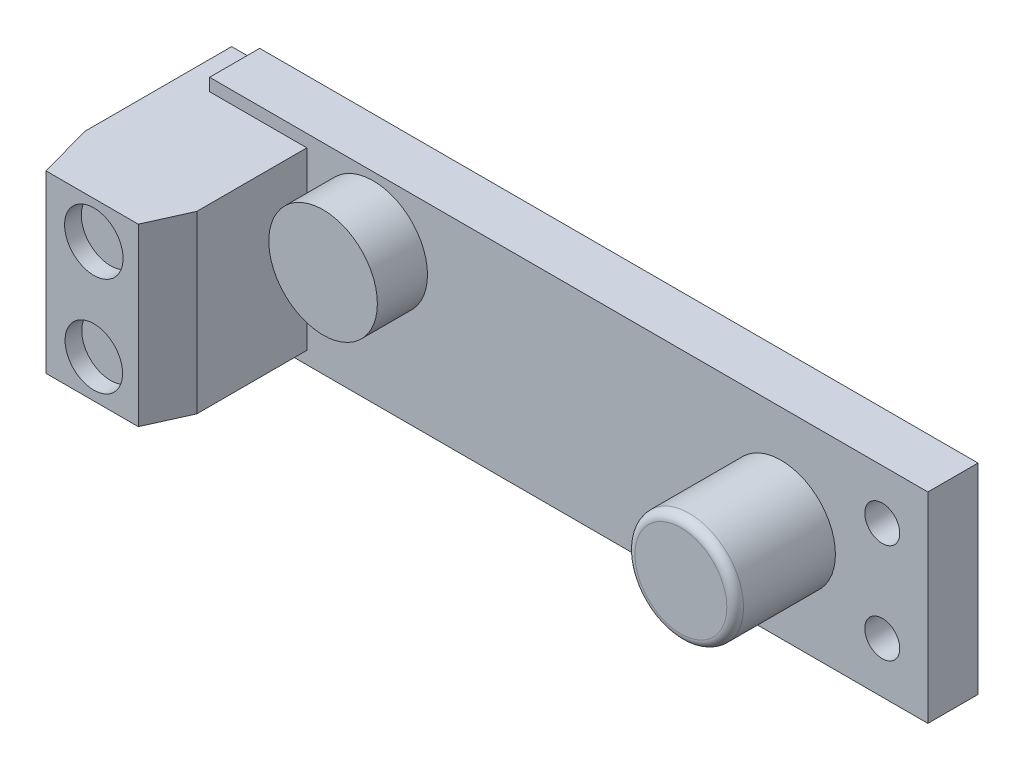
ISO-10303-21;
HEADER;
FILE_DESCRIPTION(('STEP AP214'),'2;1');
FILE_NAME('part.step','',(''),(''),'','','');
FILE_SCHEMA(('AUTOMOTIVE_DESIGN { 1 0 10303 214 1 1 1 1 }'));
ENDSEC;
DATA;
#1=APPLICATION_CONTEXT('core data for automotive mechanical design processes');
#2=APPLICATION_PROTOCOL_DEFINITION('international standard','automotive_design',2000,#1);
#3=PRODUCT_CONTEXT('',#1,'mechanical');
#4=PRODUCT('Part','Part','',(#3));
#5=PRODUCT_RELATED_PRODUCT_CATEGORY('part','',(#4));
#6=PRODUCT_DEFINITION_FORMATION('','',#4);
#7=PRODUCT_DEFINITION_CONTEXT('part definition',#1,'design');
#8=PRODUCT_DEFINITION('design','',#6,#7);
#9=PRODUCT_DEFINITION_SHAPE('','',#8);
#10=(LENGTH_UNIT() NAMED_UNIT(*) SI_UNIT(.MILLI.,.METRE.));
#11=(NAMED_UNIT(*) PLANE_ANGLE_UNIT() SI_UNIT($,.RADIAN.));
#12=(NAMED_UNIT(*) SI_UNIT($,.STERADIAN.) SOLID_ANGLE_UNIT());
#13=UNCERTAINTY_MEASURE_WITH_UNIT(LENGTH_MEASURE(1.E-05),#10,'distance_accuracy_value','');
#14=(GEOMETRIC_REPRESENTATION_CONTEXT(3) GLOBAL_UNCERTAINTY_ASSIGNED_CONTEXT((#13)) GLOBAL_UNIT_ASSIGNED_CONTEXT((#10,
#11,#12)) REPRESENTATION_CONTEXT('',''));
#15=CARTESIAN_POINT('',(0.,0.,0.));
#16=DIRECTION('',(0.,0.,1.));
#17=DIRECTION('',(1.,0.,0.));
#18=AXIS2_PLACEMENT_3D('',#15,#16,#17);
#19=CARTESIAN_POINT('',(0.,-5.25,-3.));
#20=DIRECTION('',(0.,-1.,0.));
#21=DIRECTION('',(0.,0.,-1.));
#22=AXIS2_PLACEMENT_3D('',#19,#20,#21);
#23=PLANE('',#22);
#24=DIRECTION('',(0.,0.,1.));
#25=VECTOR('',#24,1.);
#26=CARTESIAN_POINT('',(-15.6806960282271,-5.25,-3.));
#27=LINE('',#26,#25);
#28=CARTESIAN_POINT('',(-15.6806960282271,-5.25,0.));
#29=VERTEX_POINT('',#28);
#30=CARTESIAN_POINT('',(-15.6806960282271,-5.25,6.58629738210843));
#31=VERTEX_POINT('',#30);
#32=EDGE_CURVE('E161',#29,#31,#27,.T.);
#33=ORIENTED_EDGE('',*,*,#32,.T.);
#34=DIRECTION('',(-0.411059270590897,0.,0.911608620001632));
#35=VECTOR('',#34,1.);
#36=CARTESIAN_POINT('',(-9.43890619078825,-5.25,-7.25615753167666));
#37=LINE('',#36,#35);
#38=CARTESIAN_POINT('',(-16.7690741060168,-5.25,9.));
#39=VERTEX_POINT('',#38);
#40=EDGE_CURVE('E51',#31,#39,#37,.T.);
#41=ORIENTED_EDGE('',*,*,#40,.T.);
#42=DIRECTION('',(1.,0.,0.));
#43=VECTOR('',#42,1.);
#44=CARTESIAN_POINT('',(0.,-5.25,9.));
#45=LINE('',#44,#43);
#46=CARTESIAN_POINT('',(-22.2937362370876,-5.25,9.));
#47=VERTEX_POINT('',#46);
#48=EDGE_CURVE('E138',#47,#39,#45,.T.);
#49=ORIENTED_EDGE('',*,*,#48,.F.);
#50=DIRECTION('',(-0.266389023019548,0.,-0.963865596654788));
#51=VECTOR('',#50,1.);
#52=CARTESIAN_POINT('',(-23.7928619202219,-5.25,3.57576872103773));
#53=LINE('',#52,#51);
#54=CARTESIAN_POINT('',(-23.1806960282271,-5.25,5.79074603523424));
#55=VERTEX_POINT('',#54);
#56=EDGE_CURVE('E59',#47,#55,#53,.T.);
#57=ORIENTED_EDGE('',*,*,#56,.T.);
#58=DIRECTION('',(0.,0.,1.));
#59=VECTOR('',#58,1.);
#60=CARTESIAN_POINT('',(-23.1806960282271,-5.25,-3.));
#61=LINE('',#60,#59);
#62=CARTESIAN_POINT('',(-23.1806960282271,-5.25,-3.));
#63=VERTEX_POINT('',#62);
#64=EDGE_CURVE('E165',#63,#55,#61,.T.);
#65=ORIENTED_EDGE('',*,*,#64,.F.);
#66=DIRECTION('',(1.,0.,0.));
#67=VECTOR('',#66,1.);
#68=CARTESIAN_POINT('',(0.,-5.25,-3.));
#69=LINE('',#68,#67);
#70=CARTESIAN_POINT('',(-21.5,-5.25,-3.));
#71=VERTEX_POINT('',#70);
#72=EDGE_CURVE('E158',#63,#71,#69,.T.);
#73=ORIENTED_EDGE('',*,*,#72,.T.);
#74=DIRECTION('',(0.,0.,1.));
#75=VECTOR('',#74,1.);
#76=CARTESIAN_POINT('',(-21.5,-5.25,-3.));
#77=LINE('',#76,#75);
#78=CARTESIAN_POINT('',(-21.5,-5.25,0.));
#79=VERTEX_POINT('',#78);
#80=EDGE_CURVE('E237',#71,#79,#77,.T.);
#81=ORIENTED_EDGE('',*,*,#80,.T.);
#82=DIRECTION('',(1.,0.,0.));
#83=VECTOR('',#82,1.);
#84=CARTESIAN_POINT('',(0.,-5.25,0.));
#85=LINE('',#84,#83);
#86=EDGE_CURVE('E210',#79,#29,#85,.T.);
#87=ORIENTED_EDGE('',*,*,#86,.T.);
#88=EDGE_LOOP('',(#33,#41,#49,#57,#65,#73,#81,#87));
#89=FACE_BOUND('',#88,.T.);
#90=ADVANCED_FACE('F36',(#89),#23,.T.);
#91=CARTESIAN_POINT('',(0.,5.25,-3.));
#92=DIRECTION('',(0.,-1.,0.));
#93=DIRECTION('',(0.,0.,-1.));
#94=AXIS2_PLACEMENT_3D('',#91,#92,#93);
#95=PLANE('',#94);
#96=DIRECTION('',(-0.411059270590897,0.,0.911608620001632));
#97=VECTOR('',#96,1.);
#98=CARTESIAN_POINT('',(-9.43890619078825,5.25,-7.25615753167666));
#99=LINE('',#98,#97);
#100=CARTESIAN_POINT('',(-15.6806960282271,5.25,6.58629738210843));
#101=VERTEX_POINT('',#100);
#102=CARTESIAN_POINT('',(-16.7690741060168,5.25,9.));
#103=VERTEX_POINT('',#102);
#104=EDGE_CURVE('E123',#101,#103,#99,.T.);
#105=ORIENTED_EDGE('',*,*,#104,.F.);
#106=DIRECTION('',(0.,0.,1.));
#107=VECTOR('',#106,1.);
#108=CARTESIAN_POINT('',(-15.6806960282271,5.25,-3.));
#109=LINE('',#108,#107);
#110=CARTESIAN_POINT('',(-15.6806960282271,5.25,0.));
#111=VERTEX_POINT('',#110);
#112=EDGE_CURVE('E160',#111,#101,#109,.T.);
#113=ORIENTED_EDGE('',*,*,#112,.F.);
#114=DIRECTION('',(1.,0.,0.));
#115=VECTOR('',#114,1.);
#116=CARTESIAN_POINT('',(0.,5.25,0.));
#117=LINE('',#116,#115);
#118=CARTESIAN_POINT('',(-21.5,5.25,0.));
#119=VERTEX_POINT('',#118);
#120=EDGE_CURVE('E204',#119,#111,#117,.T.);
#121=ORIENTED_EDGE('',*,*,#120,.F.);
#122=DIRECTION('',(0.,0.,1.));
#123=VECTOR('',#122,1.);
#124=CARTESIAN_POINT('',(-21.5,5.25,-3.));
#125=LINE('',#124,#123);
#126=CARTESIAN_POINT('',(-21.5,5.25,-3.));
#127=VERTEX_POINT('',#126);
#128=EDGE_CURVE('E224',#127,#119,#125,.T.);
#129=ORIENTED_EDGE('',*,*,#128,.F.);
#130=DIRECTION('',(1.,0.,0.));
#131=VECTOR('',#130,1.);
#132=CARTESIAN_POINT('',(0.,5.25,-3.));
#133=LINE('',#132,#131);
#134=CARTESIAN_POINT('',(-23.1806960282271,5.25,-3.));
#135=VERTEX_POINT('',#134);
#136=EDGE_CURVE('E146',#135,#127,#133,.T.);
#137=ORIENTED_EDGE('',*,*,#136,.F.);
#138=DIRECTION('',(0.,0.,1.));
#139=VECTOR('',#138,1.);
#140=CARTESIAN_POINT('',(-23.1806960282271,5.25,-3.));
#141=LINE('',#140,#139);
#142=CARTESIAN_POINT('',(-23.1806960282271,5.25,5.79074603523424));
#143=VERTEX_POINT('',#142);
#144=EDGE_CURVE('E168',#135,#143,#141,.T.);
#145=ORIENTED_EDGE('',*,*,#144,.T.);
#146=DIRECTION('',(-0.266389023019548,0.,-0.963865596654788));
#147=VECTOR('',#146,1.);
#148=CARTESIAN_POINT('',(-23.7928619202219,5.25,3.57576872103773));
#149=LINE('',#148,#147);
#150=CARTESIAN_POINT('',(-22.2937362370876,5.25,9.));
#151=VERTEX_POINT('',#150);
#152=EDGE_CURVE('E143',#151,#143,#149,.T.);
#153=ORIENTED_EDGE('',*,*,#152,.F.);
#154=DIRECTION('',(1.,0.,0.));
#155=VECTOR('',#154,1.);
#156=CARTESIAN_POINT('',(0.,5.25,9.));
#157=LINE('',#156,#155);
#158=EDGE_CURVE('E136',#151,#103,#157,.T.);
#159=ORIENTED_EDGE('',*,*,#158,.T.);
#160=EDGE_LOOP('',(#105,#113,#121,#129,#137,#145,#153,#159));
#161=FACE_BOUND('',#160,.T.);
#162=ADVANCED_FACE('F141',(#161),#95,.F.);
#163=CARTESIAN_POINT('',(0.,0.,9.));
#164=DIRECTION('',(0.,0.,1.));
#165=DIRECTION('',(1.,0.,0.));
#166=AXIS2_PLACEMENT_3D('',#163,#164,#165);
#167=PLANE('',#166);
#168=CARTESIAN_POINT('',(-19.4306960282271,-2.9634290967381,9.));
#169=DIRECTION('',(0.,0.,1.));
#170=DIRECTION('',(1.,0.,0.));
#171=AXIS2_PLACEMENT_3D('',#168,#169,#170);
#172=CIRCLE('',#171,1.72245817540268);
#173=CARTESIAN_POINT('',(-17.7082378528245,-2.9634290967381,9.));
#174=VERTEX_POINT('',#173);
#175=EDGE_CURVE('E149',#174,#174,#172,.T.);
#176=ORIENTED_EDGE('',*,*,#175,.F.);
#177=EDGE_LOOP('',(#176));
#178=FACE_BOUND('',#177,.T.);
#179=CARTESIAN_POINT('',(-19.4306960282271,3.01281958168374,9.));
#180=DIRECTION('',(0.,0.,1.));
#181=DIRECTION('',(1.,0.,0.));
#182=AXIS2_PLACEMENT_3D('',#179,#180,#181);
#183=CIRCLE('',#182,1.75116581165939);
#184=CARTESIAN_POINT('',(-17.6795302165678,3.01281958168374,9.));
#185=VERTEX_POINT('',#184);
#186=EDGE_CURVE('E144',#185,#185,#183,.T.);
#187=ORIENTED_EDGE('',*,*,#186,.F.);
#188=EDGE_LOOP('',(#187));
#189=FACE_BOUND('',#188,.T.);
#190=ORIENTED_EDGE('',*,*,#48,.T.);
#191=DIRECTION('',(0.,-1.,0.));
#192=VECTOR('',#191,1.);
#193=CARTESIAN_POINT('',(-16.7690741060168,8.,9.));
#194=LINE('',#193,#192);
#195=EDGE_CURVE('E126',#103,#39,#194,.T.);
#196=ORIENTED_EDGE('',*,*,#195,.F.);
#197=ORIENTED_EDGE('',*,*,#158,.F.);
#198=DIRECTION('',(0.,-1.,0.));
#199=VECTOR('',#198,1.);
#200=CARTESIAN_POINT('',(-22.2937362370876,0.,9.));
#201=LINE('',#200,#199);
#202=EDGE_CURVE('E227',#151,#47,#201,.T.);
#203=ORIENTED_EDGE('',*,*,#202,.T.);
#204=EDGE_LOOP('',(#190,#196,#197,#203));
#205=FACE_BOUND('',#204,.T.);
#206=ADVANCED_FACE('F135',(#178,#189,#205),#167,.T.);
#207=CARTESIAN_POINT('',(-15.6806960282271,0.,-3.));
#208=DIRECTION('',(-1.,0.,0.));
#209=DIRECTION('',(0.,0.,1.));
#210=AXIS2_PLACEMENT_3D('',#207,#208,#209);
#211=PLANE('',#210);
#212=DIRECTION('',(0.,1.,0.));
#213=VECTOR('',#212,1.);
#214=CARTESIAN_POINT('',(-15.6806960282271,0.,6.58629738210843));
#215=LINE('',#214,#213);
#216=EDGE_CURVE('E127',#31,#101,#215,.T.);
#217=ORIENTED_EDGE('',*,*,#216,.F.);
#218=ORIENTED_EDGE('',*,*,#32,.F.);
#219=DIRECTION('',(0.,-1.,0.));
#220=VECTOR('',#219,1.);
#221=CARTESIAN_POINT('',(-15.6806960282271,0.,0.));
#222=LINE('',#221,#220);
#223=EDGE_CURVE('E207',#111,#29,#222,.T.);
#224=ORIENTED_EDGE('',*,*,#223,.F.);
#225=ORIENTED_EDGE('',*,*,#112,.T.);
#226=EDGE_LOOP('',(#217,#218,#224,#225));
#227=FACE_BOUND('',#226,.T.);
#228=ADVANCED_FACE('F266',(#227),#211,.F.);
#229=CARTESIAN_POINT('',(-23.1806960282271,0.,-3.));
#230=DIRECTION('',(-1.,0.,0.));
#231=DIRECTION('',(0.,0.,1.));
#232=AXIS2_PLACEMENT_3D('',#229,#230,#231);
#233=PLANE('',#232);
#234=ORIENTED_EDGE('',*,*,#64,.T.);
#235=DIRECTION('',(0.,-1.,0.));
#236=VECTOR('',#235,1.);
#237=CARTESIAN_POINT('',(-23.1806960282271,8.,5.79074603523424));
#238=LINE('',#237,#236);
#239=EDGE_CURVE('E351',#143,#55,#238,.T.);
#240=ORIENTED_EDGE('',*,*,#239,.F.);
#241=ORIENTED_EDGE('',*,*,#144,.F.);
#242=DIRECTION('',(0.,-1.,0.));
#243=VECTOR('',#242,1.);
#244=CARTESIAN_POINT('',(-23.1806960282271,0.,-3.));
#245=LINE('',#244,#243);
#246=EDGE_CURVE('E155',#135,#63,#245,.T.);
#247=ORIENTED_EDGE('',*,*,#246,.T.);
#248=EDGE_LOOP('',(#234,#240,#241,#247));
#249=FACE_BOUND('',#248,.T.);
#250=ADVANCED_FACE('F263',(#249),#233,.T.);
#251=CARTESIAN_POINT('',(-21.5,0.,-3.));
#252=DIRECTION('',(1.,0.,0.));
#253=DIRECTION('',(0.,0.,-1.));
#254=AXIS2_PLACEMENT_3D('',#251,#252,#253);
#255=PLANE('',#254);
#256=DIRECTION('',(0.,1.,0.));
#257=VECTOR('',#256,1.);
#258=CARTESIAN_POINT('',(-21.5,0.,0.));
#259=LINE('',#258,#257);
#260=CARTESIAN_POINT('',(-21.5,6.,0.));
#261=VERTEX_POINT('',#260);
#262=EDGE_CURVE('E178',#119,#261,#259,.T.);
#263=ORIENTED_EDGE('',*,*,#262,.T.);
#264=DIRECTION('',(0.,0.,1.));
#265=VECTOR('',#264,1.);
#266=CARTESIAN_POINT('',(-21.5,6.,-3.));
#267=LINE('',#266,#265);
#268=CARTESIAN_POINT('',(-21.5,6.,-3.));
#269=VERTEX_POINT('',#268);
#270=EDGE_CURVE('E228',#269,#261,#267,.T.);
#271=ORIENTED_EDGE('',*,*,#270,.F.);
#272=DIRECTION('',(0.,1.,0.));
#273=VECTOR('',#272,1.);
#274=CARTESIAN_POINT('',(-21.5,0.,-3.));
#275=LINE('',#274,#273);
#276=EDGE_CURVE('E185',#127,#269,#275,.T.);
#277=ORIENTED_EDGE('',*,*,#276,.F.);
#278=ORIENTED_EDGE('',*,*,#128,.T.);
#279=EDGE_LOOP('',(#263,#271,#277,#278));
#280=FACE_BOUND('',#279,.T.);
#281=ADVANCED_FACE('F265',(#280),#255,.F.);
#282=CARTESIAN_POINT('',(0.,6.,-3.));
#283=DIRECTION('',(0.,-1.,0.));
#284=DIRECTION('',(0.,0.,-1.));
#285=AXIS2_PLACEMENT_3D('',#282,#283,#284);
#286=PLANE('',#285);
#287=DIRECTION('',(1.,0.,0.));
#288=VECTOR('',#287,1.);
#289=CARTESIAN_POINT('',(0.,6.,0.));
#290=LINE('',#289,#288);
#291=CARTESIAN_POINT('',(21.5,6.,0.));
#292=VERTEX_POINT('',#291);
#293=EDGE_CURVE('E221',#261,#292,#290,.T.);
#294=ORIENTED_EDGE('',*,*,#293,.T.);
#295=DIRECTION('',(0.,0.,1.));
#296=VECTOR('',#295,1.);
#297=CARTESIAN_POINT('',(21.5,6.,-3.));
#298=LINE('',#297,#296);
#299=CARTESIAN_POINT('',(21.5,6.,-3.));
#300=VERTEX_POINT('',#299);
#301=EDGE_CURVE('E231',#300,#292,#298,.T.);
#302=ORIENTED_EDGE('',*,*,#301,.F.);
#303=DIRECTION('',(1.,0.,0.));
#304=VECTOR('',#303,1.);
#305=CARTESIAN_POINT('',(0.,6.,-3.));
#306=LINE('',#305,#304);
#307=EDGE_CURVE('E191',#269,#300,#306,.T.);
#308=ORIENTED_EDGE('',*,*,#307,.F.);
#309=ORIENTED_EDGE('',*,*,#270,.T.);
#310=EDGE_LOOP('',(#294,#302,#308,#309));
#311=FACE_BOUND('',#310,.T.);
#312=ADVANCED_FACE('F306',(#311),#286,.F.);
#313=CARTESIAN_POINT('',(21.5,0.,-3.));
#314=DIRECTION('',(1.,0.,0.));
#315=DIRECTION('',(0.,0.,-1.));
#316=AXIS2_PLACEMENT_3D('',#313,#314,#315);
#317=PLANE('',#316);
#318=DIRECTION('',(0.,1.,0.));
#319=VECTOR('',#318,1.);
#320=CARTESIAN_POINT('',(21.5,0.,0.));
#321=LINE('',#320,#319);
#322=CARTESIAN_POINT('',(21.5,-6.,0.));
#323=VERTEX_POINT('',#322);
#324=EDGE_CURVE('E218',#323,#292,#321,.T.);
#325=ORIENTED_EDGE('',*,*,#324,.F.);
#326=DIRECTION('',(0.,0.,1.));
#327=VECTOR('',#326,1.);
#328=CARTESIAN_POINT('',(21.5,-6.,-3.));
#329=LINE('',#328,#327);
#330=CARTESIAN_POINT('',(21.5,-6.,-3.));
#331=VERTEX_POINT('',#330);
#332=EDGE_CURVE('E233',#331,#323,#329,.T.);
#333=ORIENTED_EDGE('',*,*,#332,.F.);
#334=DIRECTION('',(0.,1.,0.));
#335=VECTOR('',#334,1.);
#336=CARTESIAN_POINT('',(21.5,0.,-3.));
#337=LINE('',#336,#335);
#338=EDGE_CURVE('E188',#331,#300,#337,.T.);
#339=ORIENTED_EDGE('',*,*,#338,.T.);
#340=ORIENTED_EDGE('',*,*,#301,.T.);
#341=EDGE_LOOP('',(#325,#333,#339,#340));
#342=FACE_BOUND('',#341,.T.);
#343=ADVANCED_FACE('F311',(#342),#317,.T.);
#344=CARTESIAN_POINT('',(0.,-6.,-3.));
#345=DIRECTION('',(0.,-1.,0.));
#346=DIRECTION('',(0.,0.,-1.));
#347=AXIS2_PLACEMENT_3D('',#344,#345,#346);
#348=PLANE('',#347);
#349=DIRECTION('',(1.,0.,0.));
#350=VECTOR('',#349,1.);
#351=CARTESIAN_POINT('',(0.,-6.,0.));
#352=LINE('',#351,#350);
#353=CARTESIAN_POINT('',(-21.5,-6.,0.));
#354=VERTEX_POINT('',#353);
#355=EDGE_CURVE('E215',#354,#323,#352,.T.);
#356=ORIENTED_EDGE('',*,*,#355,.F.);
#357=DIRECTION('',(0.,0.,1.));
#358=VECTOR('',#357,1.);
#359=CARTESIAN_POINT('',(-21.5,-6.,-3.));
#360=LINE('',#359,#358);
#361=CARTESIAN_POINT('',(-21.5,-6.,-3.));
#362=VERTEX_POINT('',#361);
#363=EDGE_CURVE('E235',#362,#354,#360,.T.);
#364=ORIENTED_EDGE('',*,*,#363,.F.);
#365=DIRECTION('',(1.,0.,0.));
#366=VECTOR('',#365,1.);
#367=CARTESIAN_POINT('',(0.,-6.,-3.));
#368=LINE('',#367,#366);
#369=EDGE_CURVE('E184',#362,#331,#368,.T.);
#370=ORIENTED_EDGE('',*,*,#369,.T.);
#371=ORIENTED_EDGE('',*,*,#332,.T.);
#372=EDGE_LOOP('',(#356,#364,#370,#371));
#373=FACE_BOUND('',#372,.T.);
#374=ADVANCED_FACE('F315',(#373),#348,.T.);
#375=EDGE_CURVE('E212',#354,#79,#259,.T.);
#376=ORIENTED_EDGE('',*,*,#375,.T.);
#377=ORIENTED_EDGE('',*,*,#80,.F.);
#378=EDGE_CURVE('E181',#362,#71,#275,.T.);
#379=ORIENTED_EDGE('',*,*,#378,.F.);
#380=ORIENTED_EDGE('',*,*,#363,.T.);
#381=EDGE_LOOP('',(#376,#377,#379,#380));
#382=FACE_BOUND('',#381,.T.);
#383=ADVANCED_FACE('F308',(#382),#255,.F.);
#384=CARTESIAN_POINT('',(18.7679392946399,3.01281958168374,-3.));
#385=DIRECTION('',(0.,0.,1.));
#386=DIRECTION('',(1.,0.,0.));
#387=AXIS2_PLACEMENT_3D('',#384,#385,#386);
#388=CYLINDRICAL_SURFACE('',#387,1.04773040493452);
#389=CARTESIAN_POINT('',(18.7679392946399,3.01281958168374,-3.));
#390=DIRECTION('',(0.,0.,1.));
#391=DIRECTION('',(1.,0.,0.));
#392=AXIS2_PLACEMENT_3D('',#389,#390,#391);
#393=CIRCLE('',#392,1.04773040493452);
#394=CARTESIAN_POINT('',(19.8156696995744,3.01281958168374,-3.));
#395=VERTEX_POINT('',#394);
#396=EDGE_CURVE('E177',#395,#395,#393,.T.);
#397=ORIENTED_EDGE('',*,*,#396,.F.);
#398=EDGE_LOOP('',(#397));
#399=FACE_BOUND('',#398,.T.);
#400=CARTESIAN_POINT('',(18.7679392946399,3.01281958168374,0.));
#401=DIRECTION('',(0.,0.,1.));
#402=DIRECTION('',(1.,0.,0.));
#403=AXIS2_PLACEMENT_3D('',#400,#401,#402);
#404=CIRCLE('',#403,1.04773040493452);
#405=CARTESIAN_POINT('',(19.8156696995744,3.01281958168374,0.));
#406=VERTEX_POINT('',#405);
#407=EDGE_CURVE('E195',#406,#406,#404,.T.);
#408=ORIENTED_EDGE('',*,*,#407,.T.);
#409=EDGE_LOOP('',(#408));
#410=FACE_BOUND('',#409,.T.);
#411=ADVANCED_FACE('F320',(#399,#410),#388,.F.);
#412=CARTESIAN_POINT('',(18.7679392946399,-2.9634290967381,-3.));
#413=DIRECTION('',(0.,0.,1.));
#414=DIRECTION('',(1.,0.,0.));
#415=AXIS2_PLACEMENT_3D('',#412,#413,#414);
#416=CYLINDRICAL_SURFACE('',#415,1.04773040493452);
#417=CARTESIAN_POINT('',(18.7679392946399,-2.9634290967381,-3.));
#418=DIRECTION('',(0.,0.,1.));
#419=DIRECTION('',(1.,0.,0.));
#420=AXIS2_PLACEMENT_3D('',#417,#418,#419);
#421=CIRCLE('',#420,1.04773040493452);
#422=CARTESIAN_POINT('',(19.8156696995744,-2.9634290967381,-3.));
#423=VERTEX_POINT('',#422);
#424=EDGE_CURVE('E174',#423,#423,#421,.T.);
#425=ORIENTED_EDGE('',*,*,#424,.F.);
#426=EDGE_LOOP('',(#425));
#427=FACE_BOUND('',#426,.T.);
#428=CARTESIAN_POINT('',(18.7679392946399,-2.9634290967381,0.));
#429=DIRECTION('',(0.,0.,1.));
#430=DIRECTION('',(1.,0.,0.));
#431=AXIS2_PLACEMENT_3D('',#428,#429,#430);
#432=CIRCLE('',#431,1.04773040493452);
#433=CARTESIAN_POINT('',(19.8156696995744,-2.9634290967381,0.));
#434=VERTEX_POINT('',#433);
#435=EDGE_CURVE('E173',#434,#434,#432,.T.);
#436=ORIENTED_EDGE('',*,*,#435,.T.);
#437=EDGE_LOOP('',(#436));
#438=FACE_BOUND('',#437,.T.);
#439=ADVANCED_FACE('F299',(#427,#438),#416,.F.);
#440=CARTESIAN_POINT('',(0.,0.,-3.));
#441=DIRECTION('',(0.,0.,1.));
#442=DIRECTION('',(1.,0.,0.));
#443=AXIS2_PLACEMENT_3D('',#440,#441,#442);
#444=PLANE('',#443);
#445=ORIENTED_EDGE('',*,*,#424,.T.);
#446=EDGE_LOOP('',(#445));
#447=FACE_BOUND('',#446,.T.);
#448=ORIENTED_EDGE('',*,*,#396,.T.);
#449=EDGE_LOOP('',(#448));
#450=FACE_BOUND('',#449,.T.);
#451=ORIENTED_EDGE('',*,*,#378,.T.);
#452=ORIENTED_EDGE('',*,*,#72,.F.);
#453=ORIENTED_EDGE('',*,*,#246,.F.);
#454=ORIENTED_EDGE('',*,*,#136,.T.);
#455=ORIENTED_EDGE('',*,*,#276,.T.);
#456=ORIENTED_EDGE('',*,*,#307,.T.);
#457=ORIENTED_EDGE('',*,*,#338,.F.);
#458=ORIENTED_EDGE('',*,*,#369,.F.);
#459=EDGE_LOOP('',(#451,#452,#453,#454,#455,#456,#457,#458));
#460=FACE_BOUND('',#459,.T.);
#461=ADVANCED_FACE('F296',(#447,#450,#460),#444,.F.);
#462=CARTESIAN_POINT('',(0.,0.,0.));
#463=DIRECTION('',(0.,0.,1.));
#464=DIRECTION('',(1.,0.,0.));
#465=AXIS2_PLACEMENT_3D('',#462,#463,#464);
#466=PLANE('',#465);
#467=ORIENTED_EDGE('',*,*,#435,.F.);
#468=EDGE_LOOP('',(#467));
#469=FACE_BOUND('',#468,.T.);
#470=ORIENTED_EDGE('',*,*,#407,.F.);
#471=EDGE_LOOP('',(#470));
#472=FACE_BOUND('',#471,.T.);
#473=CARTESIAN_POINT('',(12.7136448983962,0.,0.));
#474=DIRECTION('',(0.,0.,1.));
#475=DIRECTION('',(1.,0.,0.));
#476=AXIS2_PLACEMENT_3D('',#473,#474,#475);
#477=CIRCLE('',#476,3.25);
#478=CARTESIAN_POINT('',(15.9636448983962,0.,0.));
#479=VERTEX_POINT('',#478);
#480=EDGE_CURVE('E198',#479,#479,#477,.T.);
#481=ORIENTED_EDGE('',*,*,#480,.F.);
#482=EDGE_LOOP('',(#481));
#483=FACE_BOUND('',#482,.T.);
#484=CARTESIAN_POINT('',(-11.7060995728953,2.28048738711186,0.));
#485=DIRECTION('',(0.,0.,1.));
#486=DIRECTION('',(1.,0.,0.));
#487=AXIS2_PLACEMENT_3D('',#484,#485,#486);
#488=CIRCLE('',#487,3.25);
#489=CARTESIAN_POINT('',(-8.45609957289527,2.28048738711186,0.));
#490=VERTEX_POINT('',#489);
#491=EDGE_CURVE('E201',#490,#490,#488,.T.);
#492=ORIENTED_EDGE('',*,*,#491,.F.);
#493=EDGE_LOOP('',(#492));
#494=FACE_BOUND('',#493,.T.);
#495=ORIENTED_EDGE('',*,*,#120,.T.);
#496=ORIENTED_EDGE('',*,*,#223,.T.);
#497=ORIENTED_EDGE('',*,*,#86,.F.);
#498=ORIENTED_EDGE('',*,*,#375,.F.);
#499=ORIENTED_EDGE('',*,*,#355,.T.);
#500=ORIENTED_EDGE('',*,*,#324,.T.);
#501=ORIENTED_EDGE('',*,*,#293,.F.);
#502=ORIENTED_EDGE('',*,*,#262,.F.);
#503=EDGE_LOOP('',(#495,#496,#497,#498,#499,#500,#501,#502));
#504=FACE_BOUND('',#503,.T.);
#505=ADVANCED_FACE('F291',(#469,#472,#483,#494,#504),#466,.T.);
#506=CARTESIAN_POINT('',(0.,0.,3.));
#507=DIRECTION('',(0.,0.,1.));
#508=DIRECTION('',(1.,0.,0.));
#509=AXIS2_PLACEMENT_3D('',#506,#507,#508);
#510=PLANE('',#509);
#511=CARTESIAN_POINT('',(-11.7060995728953,2.28048738711186,3.));
#512=DIRECTION('',(0.,0.,1.));
#513=DIRECTION('',(1.,0.,0.));
#514=AXIS2_PLACEMENT_3D('',#511,#512,#513);
#515=CIRCLE('',#514,3.25);
#516=CARTESIAN_POINT('',(-8.45609957289527,2.28048738711186,3.));
#517=VERTEX_POINT('',#516);
#518=EDGE_CURVE('E164',#517,#517,#515,.T.);
#519=ORIENTED_EDGE('',*,*,#518,.T.);
#520=EDGE_LOOP('',(#519));
#521=FACE_BOUND('',#520,.T.);
#522=ADVANCED_FACE('F288',(#521),#510,.T.);
#523=CARTESIAN_POINT('',(-11.7060995728953,2.28048738711186,-3.));
#524=DIRECTION('',(0.,0.,1.));
#525=DIRECTION('',(1.,0.,0.));
#526=AXIS2_PLACEMENT_3D('',#523,#524,#525);
#527=CYLINDRICAL_SURFACE('',#526,3.25);
#528=ORIENTED_EDGE('',*,*,#491,.T.);
#529=EDGE_LOOP('',(#528));
#530=FACE_BOUND('',#529,.T.);
#531=ORIENTED_EDGE('',*,*,#518,.F.);
#532=EDGE_LOOP('',(#531));
#533=FACE_BOUND('',#532,.T.);
#534=ADVANCED_FACE('F284',(#530,#533),#527,.T.);
#535=CARTESIAN_POINT('',(0.,0.,6.));
#536=DIRECTION('',(0.,0.,1.));
#537=DIRECTION('',(1.,0.,0.));
#538=AXIS2_PLACEMENT_3D('',#535,#536,#537);
#539=PLANE('',#538);
#540=CARTESIAN_POINT('',(12.7136448983962,0.,6.));
#541=DIRECTION('',(0.,0.,1.));
#542=DIRECTION('',(1.,0.,0.));
#543=AXIS2_PLACEMENT_3D('',#540,#541,#542);
#544=CIRCLE('',#543,2.75);
#545=CARTESIAN_POINT('',(15.4636448983962,0.,6.));
#546=VERTEX_POINT('',#545);
#547=EDGE_CURVE('E44',#546,#546,#544,.T.);
#548=ORIENTED_EDGE('',*,*,#547,.T.);
#549=EDGE_LOOP('',(#548));
#550=FACE_BOUND('',#549,.T.);
#551=ADVANCED_FACE('F243',(#550),#539,.T.);
#552=CARTESIAN_POINT('',(12.7136448983962,0.,-3.));
#553=DIRECTION('',(0.,0.,1.));
#554=DIRECTION('',(1.,0.,0.));
#555=AXIS2_PLACEMENT_3D('',#552,#553,#554);
#556=CYLINDRICAL_SURFACE('',#555,3.25);
#557=CARTESIAN_POINT('',(12.7136448983962,0.,5.5));
#558=DIRECTION('',(0.,0.,1.));
#559=DIRECTION('',(1.,0.,0.));
#560=AXIS2_PLACEMENT_3D('',#557,#558,#559);
#561=CIRCLE('',#560,3.25);
#562=CARTESIAN_POINT('',(15.9636448983962,0.,5.5));
#563=VERTEX_POINT('',#562);
#564=EDGE_CURVE('E11',#563,#563,#561,.F.);
#565=ORIENTED_EDGE('',*,*,#564,.T.);
#566=EDGE_LOOP('',(#565));
#567=FACE_BOUND('',#566,.T.);
#568=ORIENTED_EDGE('',*,*,#480,.T.);
#569=EDGE_LOOP('',(#568));
#570=FACE_BOUND('',#569,.T.);
#571=ADVANCED_FACE('F276',(#567,#570),#556,.T.);
#572=CARTESIAN_POINT('',(-19.4306960282271,3.01281958168374,-3.));
#573=DIRECTION('',(0.,0.,1.));
#574=DIRECTION('',(1.,0.,0.));
#575=AXIS2_PLACEMENT_3D('',#572,#573,#574);
#576=CYLINDRICAL_SURFACE('',#575,1.75116581165939);
#577=CARTESIAN_POINT('',(-19.4306960282271,3.01281958168374,8.));
#578=DIRECTION('',(0.,0.,1.));
#579=DIRECTION('',(1.,0.,0.));
#580=AXIS2_PLACEMENT_3D('',#577,#578,#579);
#581=CIRCLE('',#580,1.75116581165939);
#582=CARTESIAN_POINT('',(-17.6795302165678,3.01281958168374,8.));
#583=VERTEX_POINT('',#582);
#584=EDGE_CURVE('E360',#583,#583,#581,.T.);
#585=ORIENTED_EDGE('',*,*,#584,.F.);
#586=EDGE_LOOP('',(#585));
#587=FACE_BOUND('',#586,.T.);
#588=ORIENTED_EDGE('',*,*,#186,.T.);
#589=EDGE_LOOP('',(#588));
#590=FACE_BOUND('',#589,.T.);
#591=ADVANCED_FACE('F272',(#587,#590),#576,.F.);
#592=CARTESIAN_POINT('',(-19.4306960282271,-2.9634290967381,-3.));
#593=DIRECTION('',(0.,0.,1.));
#594=DIRECTION('',(1.,0.,0.));
#595=AXIS2_PLACEMENT_3D('',#592,#593,#594);
#596=CYLINDRICAL_SURFACE('',#595,1.72245817540268);
#597=CARTESIAN_POINT('',(-19.4306960282271,-2.9634290967381,8.));
#598=DIRECTION('',(0.,0.,1.));
#599=DIRECTION('',(1.,0.,0.));
#600=AXIS2_PLACEMENT_3D('',#597,#598,#599);
#601=CIRCLE('',#600,1.72245817540268);
#602=CARTESIAN_POINT('',(-17.7082378528245,-2.9634290967381,8.));
#603=VERTEX_POINT('',#602);
#604=EDGE_CURVE('E357',#603,#603,#601,.T.);
#605=ORIENTED_EDGE('',*,*,#604,.F.);
#606=EDGE_LOOP('',(#605));
#607=FACE_BOUND('',#606,.T.);
#608=ORIENTED_EDGE('',*,*,#175,.T.);
#609=EDGE_LOOP('',(#608));
#610=FACE_BOUND('',#609,.T.);
#611=ADVANCED_FACE('F275',(#607,#610),#596,.F.);
#612=CARTESIAN_POINT('',(0.,0.,8.));
#613=DIRECTION('',(0.,0.,1.));
#614=DIRECTION('',(1.,0.,0.));
#615=AXIS2_PLACEMENT_3D('',#612,#613,#614);
#616=PLANE('',#615);
#617=ORIENTED_EDGE('',*,*,#584,.T.);
#618=EDGE_LOOP('',(#617));
#619=FACE_BOUND('',#618,.T.);
#620=ADVANCED_FACE('F280',(#619),#616,.T.);
#621=CARTESIAN_POINT('',(0.,0.,8.));
#622=DIRECTION('',(0.,0.,1.));
#623=DIRECTION('',(1.,0.,0.));
#624=AXIS2_PLACEMENT_3D('',#621,#622,#623);
#625=PLANE('',#624);
#626=ORIENTED_EDGE('',*,*,#604,.T.);
#627=EDGE_LOOP('',(#626));
#628=FACE_BOUND('',#627,.T.);
#629=ADVANCED_FACE('F479',(#628),#625,.T.);
#630=CARTESIAN_POINT('',(-23.1806960282271,8.,5.79074603523424));
#631=DIRECTION('',(-0.963865596654788,0.,0.266389023019548));
#632=DIRECTION('',(0.266389023019548,0.,0.963865596654788));
#633=AXIS2_PLACEMENT_3D('',#630,#631,#632);
#634=PLANE('',#633);
#635=ORIENTED_EDGE('',*,*,#202,.F.);
#636=ORIENTED_EDGE('',*,*,#152,.T.);
#637=ORIENTED_EDGE('',*,*,#239,.T.);
#638=ORIENTED_EDGE('',*,*,#56,.F.);
#639=EDGE_LOOP('',(#635,#636,#637,#638));
#640=FACE_BOUND('',#639,.T.);
#641=ADVANCED_FACE('F250',(#640),#634,.T.);
#642=CARTESIAN_POINT('',(-15.6806960282271,8.,6.58629738210843));
#643=DIRECTION('',(0.911608620001632,0.,0.411059270590897));
#644=DIRECTION('',(0.411059270590897,0.,-0.911608620001632));
#645=AXIS2_PLACEMENT_3D('',#642,#643,#644);
#646=PLANE('',#645);
#647=ORIENTED_EDGE('',*,*,#216,.T.);
#648=ORIENTED_EDGE('',*,*,#104,.T.);
#649=ORIENTED_EDGE('',*,*,#195,.T.);
#650=ORIENTED_EDGE('',*,*,#40,.F.);
#651=EDGE_LOOP('',(#647,#648,#649,#650));
#652=FACE_BOUND('',#651,.T.);
#653=ADVANCED_FACE('F125',(#652),#646,.T.);
#654=CARTESIAN_POINT('',(12.7136448983962,0.,5.5));
#655=DIRECTION('',(0.,0.,1.));
#656=DIRECTION('',(1.,0.,0.));
#657=AXIS2_PLACEMENT_3D('',#654,#655,#656);
#658=TOROIDAL_SURFACE('',#657,2.75,0.5);
#659=ORIENTED_EDGE('',*,*,#564,.F.);
#660=EDGE_LOOP('',(#659));
#661=FACE_BOUND('',#660,.T.);
#662=ORIENTED_EDGE('',*,*,#547,.F.);
#663=EDGE_LOOP('',(#662));
#664=FACE_BOUND('',#663,.T.);
#665=ADVANCED_FACE('F38',(#661,#664),#658,.T.);
#666=CLOSED_SHELL('',(#90,#162,#206,#228,#250,#281,#312,#343,#374,#383,#411,#439,#461,#505,#522,
#534,#551,#571,#591,#611,#620,#629,#641,#653,#665));
#667=MANIFOLD_SOLID_BREP('B2',#666);
#668=ADVANCED_BREP_SHAPE_REPRESENTATION('',(#18,#667),#14);
#669=SHAPE_DEFINITION_REPRESENTATION(#9,#668);
ENDSEC;
END-ISO-10303-21;
